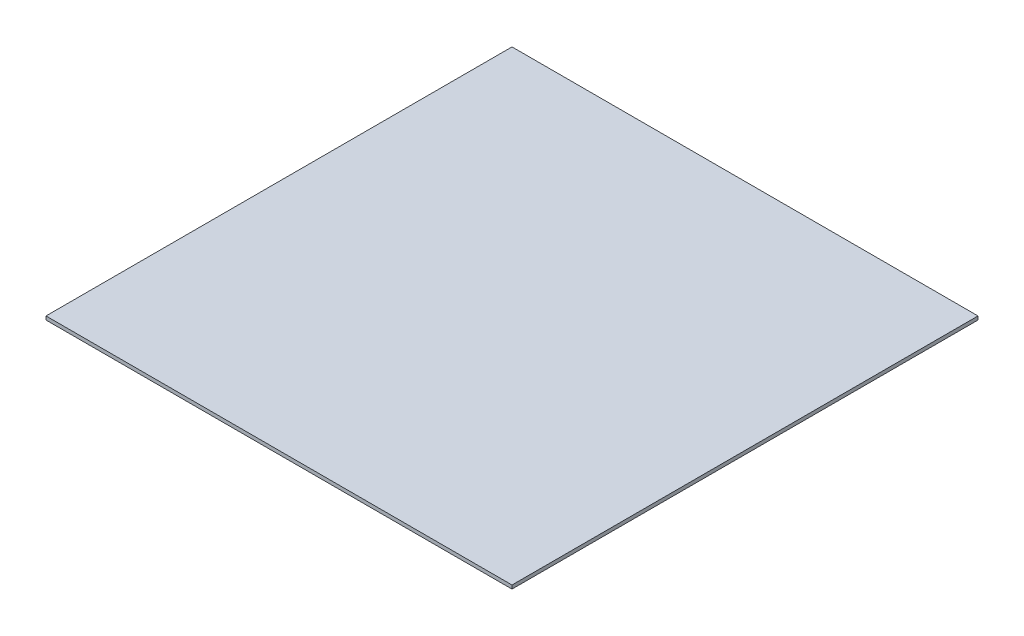
ISO-10303-21;
HEADER;
FILE_DESCRIPTION(('STEP AP214'),'2;1');
FILE_NAME('part.step','',(''),(''),'','','');
FILE_SCHEMA(('AUTOMOTIVE_DESIGN { 1 0 10303 214 1 1 1 1 }'));
ENDSEC;
DATA;
#1=APPLICATION_CONTEXT('core data for automotive mechanical design processes');
#2=APPLICATION_PROTOCOL_DEFINITION('international standard','automotive_design',2000,#1);
#3=PRODUCT_CONTEXT('',#1,'mechanical');
#4=PRODUCT('Part','Part','',(#3));
#5=PRODUCT_RELATED_PRODUCT_CATEGORY('part','',(#4));
#6=PRODUCT_DEFINITION_FORMATION('','',#4);
#7=PRODUCT_DEFINITION_CONTEXT('part definition',#1,'design');
#8=PRODUCT_DEFINITION('design','',#6,#7);
#9=PRODUCT_DEFINITION_SHAPE('','',#8);
#10=(LENGTH_UNIT() NAMED_UNIT(*) SI_UNIT(.MILLI.,.METRE.));
#11=(NAMED_UNIT(*) PLANE_ANGLE_UNIT() SI_UNIT($,.RADIAN.));
#12=(NAMED_UNIT(*) SI_UNIT($,.STERADIAN.) SOLID_ANGLE_UNIT());
#13=UNCERTAINTY_MEASURE_WITH_UNIT(LENGTH_MEASURE(1.E-05),#10,'distance_accuracy_value','');
#14=(GEOMETRIC_REPRESENTATION_CONTEXT(3) GLOBAL_UNCERTAINTY_ASSIGNED_CONTEXT((#13)) GLOBAL_UNIT_ASSIGNED_CONTEXT((#10,
#11,#12)) REPRESENTATION_CONTEXT('',''));
#15=CARTESIAN_POINT('',(0.,0.,0.));
#16=DIRECTION('',(0.,0.,1.));
#17=DIRECTION('',(1.,0.,0.));
#18=AXIS2_PLACEMENT_3D('',#15,#16,#17);
#19=CARTESIAN_POINT('',(195.,3.,-195.));
#20=DIRECTION('',(-1.,0.,0.));
#21=DIRECTION('',(0.,0.,1.));
#22=AXIS2_PLACEMENT_3D('',#19,#20,#21);
#23=PLANE('',#22);
#24=DIRECTION('',(0.,0.,-1.));
#25=VECTOR('',#24,1.);
#26=CARTESIAN_POINT('',(195.,0.,-195.));
#27=LINE('',#26,#25);
#28=CARTESIAN_POINT('',(195.,0.,195.));
#29=VERTEX_POINT('',#28);
#30=CARTESIAN_POINT('',(195.,0.,-195.));
#31=VERTEX_POINT('',#30);
#32=EDGE_CURVE('E107',#29,#31,#27,.T.);
#33=ORIENTED_EDGE('',*,*,#32,.T.);
#34=DIRECTION('',(0.,-1.,0.));
#35=VECTOR('',#34,1.);
#36=CARTESIAN_POINT('',(195.,3.,-195.));
#37=LINE('',#36,#35);
#38=CARTESIAN_POINT('',(195.,3.,-195.));
#39=VERTEX_POINT('',#38);
#40=EDGE_CURVE('E11',#39,#31,#37,.T.);
#41=ORIENTED_EDGE('',*,*,#40,.F.);
#42=DIRECTION('',(0.,0.,-1.));
#43=VECTOR('',#42,1.);
#44=CARTESIAN_POINT('',(195.,3.,-195.));
#45=LINE('',#44,#43);
#46=CARTESIAN_POINT('',(195.,3.,195.));
#47=VERTEX_POINT('',#46);
#48=EDGE_CURVE('E91',#47,#39,#45,.T.);
#49=ORIENTED_EDGE('',*,*,#48,.F.);
#50=DIRECTION('',(0.,-1.,0.));
#51=VECTOR('',#50,1.);
#52=CARTESIAN_POINT('',(195.,3.,195.));
#53=LINE('',#52,#51);
#54=EDGE_CURVE('E103',#47,#29,#53,.T.);
#55=ORIENTED_EDGE('',*,*,#54,.T.);
#56=EDGE_LOOP('',(#33,#41,#49,#55));
#57=FACE_BOUND('',#56,.T.);
#58=ADVANCED_FACE('F39',(#57),#23,.F.);
#59=CARTESIAN_POINT('',(-195.,3.,-195.));
#60=DIRECTION('',(0.,0.,1.));
#61=DIRECTION('',(1.,0.,0.));
#62=AXIS2_PLACEMENT_3D('',#59,#60,#61);
#63=PLANE('',#62);
#64=DIRECTION('',(-1.,0.,0.));
#65=VECTOR('',#64,1.);
#66=CARTESIAN_POINT('',(-195.,0.,-195.));
#67=LINE('',#66,#65);
#68=CARTESIAN_POINT('',(-195.,0.,-195.));
#69=VERTEX_POINT('',#68);
#70=EDGE_CURVE('E96',#31,#69,#67,.T.);
#71=ORIENTED_EDGE('',*,*,#70,.T.);
#72=DIRECTION('',(0.,-1.,0.));
#73=VECTOR('',#72,1.);
#74=CARTESIAN_POINT('',(-195.,3.,-195.));
#75=LINE('',#74,#73);
#76=CARTESIAN_POINT('',(-195.,3.,-195.));
#77=VERTEX_POINT('',#76);
#78=EDGE_CURVE('E48',#77,#69,#75,.T.);
#79=ORIENTED_EDGE('',*,*,#78,.F.);
#80=DIRECTION('',(-1.,0.,0.));
#81=VECTOR('',#80,1.);
#82=CARTESIAN_POINT('',(-195.,3.,-195.));
#83=LINE('',#82,#81);
#84=EDGE_CURVE('E86',#39,#77,#83,.T.);
#85=ORIENTED_EDGE('',*,*,#84,.F.);
#86=ORIENTED_EDGE('',*,*,#40,.T.);
#87=EDGE_LOOP('',(#71,#79,#85,#86));
#88=FACE_BOUND('',#87,.T.);
#89=ADVANCED_FACE('F95',(#88),#63,.F.);
#90=CARTESIAN_POINT('',(-195.,3.,-195.));
#91=DIRECTION('',(1.,0.,0.));
#92=DIRECTION('',(0.,0.,-1.));
#93=AXIS2_PLACEMENT_3D('',#90,#91,#92);
#94=PLANE('',#93);
#95=DIRECTION('',(0.,0.,1.));
#96=VECTOR('',#95,1.);
#97=CARTESIAN_POINT('',(-195.,0.,-195.));
#98=LINE('',#97,#96);
#99=CARTESIAN_POINT('',(-195.,0.,195.));
#100=VERTEX_POINT('',#99);
#101=EDGE_CURVE('E73',#69,#100,#98,.T.);
#102=ORIENTED_EDGE('',*,*,#101,.T.);
#103=DIRECTION('',(0.,-1.,0.));
#104=VECTOR('',#103,1.);
#105=CARTESIAN_POINT('',(-195.,3.,195.));
#106=LINE('',#105,#104);
#107=CARTESIAN_POINT('',(-195.,3.,195.));
#108=VERTEX_POINT('',#107);
#109=EDGE_CURVE('E98',#108,#100,#106,.T.);
#110=ORIENTED_EDGE('',*,*,#109,.F.);
#111=DIRECTION('',(0.,0.,1.));
#112=VECTOR('',#111,1.);
#113=CARTESIAN_POINT('',(-195.,3.,-195.));
#114=LINE('',#113,#112);
#115=EDGE_CURVE('E89',#77,#108,#114,.T.);
#116=ORIENTED_EDGE('',*,*,#115,.F.);
#117=ORIENTED_EDGE('',*,*,#78,.T.);
#118=EDGE_LOOP('',(#102,#110,#116,#117));
#119=FACE_BOUND('',#118,.T.);
#120=ADVANCED_FACE('F99',(#119),#94,.F.);
#121=CARTESIAN_POINT('',(-195.,3.,195.));
#122=DIRECTION('',(0.,0.,-1.));
#123=DIRECTION('',(-1.,0.,0.));
#124=AXIS2_PLACEMENT_3D('',#121,#122,#123);
#125=PLANE('',#124);
#126=DIRECTION('',(1.,0.,0.));
#127=VECTOR('',#126,1.);
#128=CARTESIAN_POINT('',(-195.,0.,195.));
#129=LINE('',#128,#127);
#130=EDGE_CURVE('E79',#100,#29,#129,.T.);
#131=ORIENTED_EDGE('',*,*,#130,.T.);
#132=ORIENTED_EDGE('',*,*,#54,.F.);
#133=DIRECTION('',(1.,0.,0.));
#134=VECTOR('',#133,1.);
#135=CARTESIAN_POINT('',(-195.,3.,195.));
#136=LINE('',#135,#134);
#137=EDGE_CURVE('E56',#108,#47,#136,.T.);
#138=ORIENTED_EDGE('',*,*,#137,.F.);
#139=ORIENTED_EDGE('',*,*,#109,.T.);
#140=EDGE_LOOP('',(#131,#132,#138,#139));
#141=FACE_BOUND('',#140,.T.);
#142=ADVANCED_FACE('F120',(#141),#125,.F.);
#143=CARTESIAN_POINT('',(0.,3.,0.));
#144=DIRECTION('',(0.,1.,0.));
#145=DIRECTION('',(0.,0.,1.));
#146=AXIS2_PLACEMENT_3D('',#143,#144,#145);
#147=PLANE('',#146);
#148=ORIENTED_EDGE('',*,*,#48,.T.);
#149=ORIENTED_EDGE('',*,*,#84,.T.);
#150=ORIENTED_EDGE('',*,*,#115,.T.);
#151=ORIENTED_EDGE('',*,*,#137,.T.);
#152=EDGE_LOOP('',(#148,#149,#150,#151));
#153=FACE_BOUND('',#152,.T.);
#154=ADVANCED_FACE('F87',(#153),#147,.T.);
#155=CARTESIAN_POINT('',(0.,0.,0.));
#156=DIRECTION('',(0.,1.,0.));
#157=DIRECTION('',(0.,0.,1.));
#158=AXIS2_PLACEMENT_3D('',#155,#156,#157);
#159=PLANE('',#158);
#160=ORIENTED_EDGE('',*,*,#32,.F.);
#161=ORIENTED_EDGE('',*,*,#130,.F.);
#162=ORIENTED_EDGE('',*,*,#101,.F.);
#163=ORIENTED_EDGE('',*,*,#70,.F.);
#164=EDGE_LOOP('',(#160,#161,#162,#163));
#165=FACE_BOUND('',#164,.T.);
#166=ADVANCED_FACE('F123',(#165),#159,.F.);
#167=CLOSED_SHELL('',(#58,#89,#120,#142,#154,#166));
#168=MANIFOLD_SOLID_BREP('B2',#167);
#169=ADVANCED_BREP_SHAPE_REPRESENTATION('',(#18,#168),#14);
#170=SHAPE_DEFINITION_REPRESENTATION(#9,#169);
ENDSEC;
END-ISO-10303-21;
